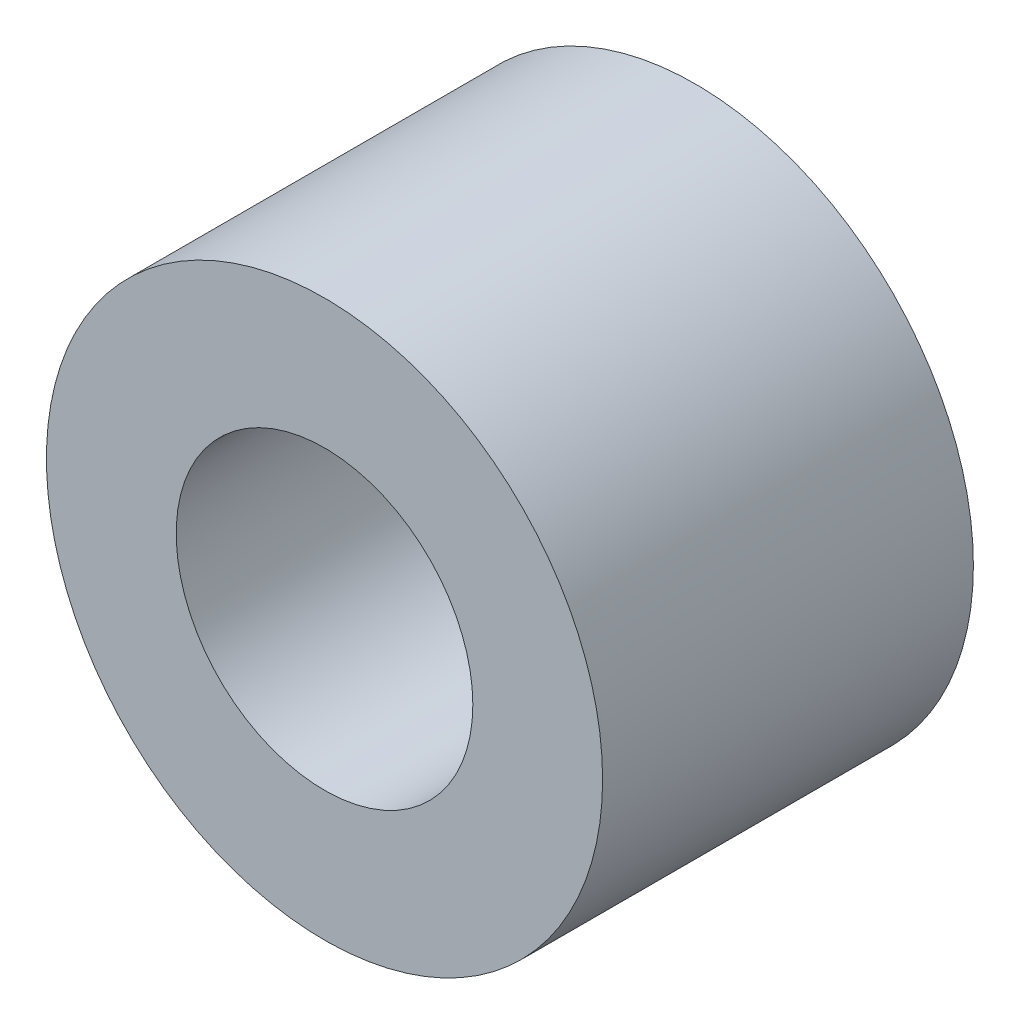
ISO-10303-21;
HEADER;
FILE_DESCRIPTION(('STEP AP214'),'2;1');
FILE_NAME('part.step','',(''),(''),'','','');
FILE_SCHEMA(('AUTOMOTIVE_DESIGN { 1 0 10303 214 1 1 1 1 }'));
ENDSEC;
DATA;
#1=APPLICATION_CONTEXT('core data for automotive mechanical design processes');
#2=APPLICATION_PROTOCOL_DEFINITION('international standard','automotive_design',2000,#1);
#3=PRODUCT_CONTEXT('',#1,'mechanical');
#4=PRODUCT('Part','Part','',(#3));
#5=PRODUCT_RELATED_PRODUCT_CATEGORY('part','',(#4));
#6=PRODUCT_DEFINITION_FORMATION('','',#4);
#7=PRODUCT_DEFINITION_CONTEXT('part definition',#1,'design');
#8=PRODUCT_DEFINITION('design','',#6,#7);
#9=PRODUCT_DEFINITION_SHAPE('','',#8);
#10=(LENGTH_UNIT() NAMED_UNIT(*) SI_UNIT(.MILLI.,.METRE.));
#11=(NAMED_UNIT(*) PLANE_ANGLE_UNIT() SI_UNIT($,.RADIAN.));
#12=(NAMED_UNIT(*) SI_UNIT($,.STERADIAN.) SOLID_ANGLE_UNIT());
#13=UNCERTAINTY_MEASURE_WITH_UNIT(LENGTH_MEASURE(1.E-05),#10,'distance_accuracy_value','');
#14=(GEOMETRIC_REPRESENTATION_CONTEXT(3) GLOBAL_UNCERTAINTY_ASSIGNED_CONTEXT((#13)) GLOBAL_UNIT_ASSIGNED_CONTEXT((#10,
#11,#12)) REPRESENTATION_CONTEXT('',''));
#15=CARTESIAN_POINT('',(0.,0.,0.));
#16=DIRECTION('',(0.,0.,1.));
#17=DIRECTION('',(1.,0.,0.));
#18=AXIS2_PLACEMENT_3D('',#15,#16,#17);
#19=CARTESIAN_POINT('',(0.,0.,2.));
#20=DIRECTION('',(0.,0.,1.));
#21=DIRECTION('',(1.,0.,0.));
#22=AXIS2_PLACEMENT_3D('',#19,#20,#21);
#23=PLANE('',#22);
#24=CARTESIAN_POINT('',(0.,0.,2.));
#25=DIRECTION('',(0.,0.,1.));
#26=DIRECTION('',(1.,0.,0.));
#27=AXIS2_PLACEMENT_3D('',#24,#25,#26);
#28=CIRCLE('',#27,3.);
#29=CARTESIAN_POINT('',(3.,0.,2.));
#30=VERTEX_POINT('',#29);
#31=EDGE_CURVE('E10',#30,#30,#28,.T.);
#32=ORIENTED_EDGE('',*,*,#31,.T.);
#33=EDGE_LOOP('',(#32));
#34=FACE_BOUND('',#33,.T.);
#35=CARTESIAN_POINT('',(0.,0.,2.));
#36=DIRECTION('',(0.,0.,1.));
#37=DIRECTION('',(1.,0.,0.));
#38=AXIS2_PLACEMENT_3D('',#35,#36,#37);
#39=CIRCLE('',#38,1.6);
#40=CARTESIAN_POINT('',(1.6,0.,2.));
#41=VERTEX_POINT('',#40);
#42=EDGE_CURVE('E60',#41,#41,#39,.T.);
#43=ORIENTED_EDGE('',*,*,#42,.F.);
#44=EDGE_LOOP('',(#43));
#45=FACE_BOUND('',#44,.T.);
#46=ADVANCED_FACE('F44',(#34,#45),#23,.T.);
#47=CARTESIAN_POINT('',(0.,0.,-2.));
#48=DIRECTION('',(0.,0.,1.));
#49=DIRECTION('',(1.,0.,0.));
#50=AXIS2_PLACEMENT_3D('',#47,#48,#49);
#51=PLANE('',#50);
#52=CARTESIAN_POINT('',(0.,0.,-2.));
#53=DIRECTION('',(0.,0.,1.));
#54=DIRECTION('',(1.,0.,0.));
#55=AXIS2_PLACEMENT_3D('',#52,#53,#54);
#56=CIRCLE('',#55,3.);
#57=CARTESIAN_POINT('',(3.,0.,-2.));
#58=VERTEX_POINT('',#57);
#59=EDGE_CURVE('E49',#58,#58,#56,.T.);
#60=ORIENTED_EDGE('',*,*,#59,.F.);
#61=EDGE_LOOP('',(#60));
#62=FACE_BOUND('',#61,.T.);
#63=CARTESIAN_POINT('',(0.,0.,-2.));
#64=DIRECTION('',(0.,0.,1.));
#65=DIRECTION('',(1.,0.,0.));
#66=AXIS2_PLACEMENT_3D('',#63,#64,#65);
#67=CIRCLE('',#66,1.6);
#68=CARTESIAN_POINT('',(1.6,0.,-2.));
#69=VERTEX_POINT('',#68);
#70=EDGE_CURVE('E56',#69,#69,#67,.T.);
#71=ORIENTED_EDGE('',*,*,#70,.T.);
#72=EDGE_LOOP('',(#71));
#73=FACE_BOUND('',#72,.T.);
#74=ADVANCED_FACE('F66',(#62,#73),#51,.F.);
#75=CARTESIAN_POINT('',(0.,0.,2.));
#76=DIRECTION('',(0.,0.,-1.));
#77=DIRECTION('',(-1.,0.,0.));
#78=AXIS2_PLACEMENT_3D('',#75,#76,#77);
#79=CYLINDRICAL_SURFACE('',#78,3.);
#80=ORIENTED_EDGE('',*,*,#31,.F.);
#81=EDGE_LOOP('',(#80));
#82=FACE_BOUND('',#81,.T.);
#83=ORIENTED_EDGE('',*,*,#59,.T.);
#84=EDGE_LOOP('',(#83));
#85=FACE_BOUND('',#84,.T.);
#86=ADVANCED_FACE('F48',(#82,#85),#79,.T.);
#87=CARTESIAN_POINT('',(0.,0.,2.));
#88=DIRECTION('',(0.,0.,-1.));
#89=DIRECTION('',(-1.,0.,0.));
#90=AXIS2_PLACEMENT_3D('',#87,#88,#89);
#91=CYLINDRICAL_SURFACE('',#90,1.6);
#92=ORIENTED_EDGE('',*,*,#42,.T.);
#93=EDGE_LOOP('',(#92));
#94=FACE_BOUND('',#93,.T.);
#95=ORIENTED_EDGE('',*,*,#70,.F.);
#96=EDGE_LOOP('',(#95));
#97=FACE_BOUND('',#96,.T.);
#98=ADVANCED_FACE('F65',(#94,#97),#91,.F.);
#99=CLOSED_SHELL('',(#46,#74,#86,#98));
#100=MANIFOLD_SOLID_BREP('B2',#99);
#101=ADVANCED_BREP_SHAPE_REPRESENTATION('',(#18,#100),#14);
#102=SHAPE_DEFINITION_REPRESENTATION(#9,#101);
ENDSEC;
END-ISO-10303-21;
